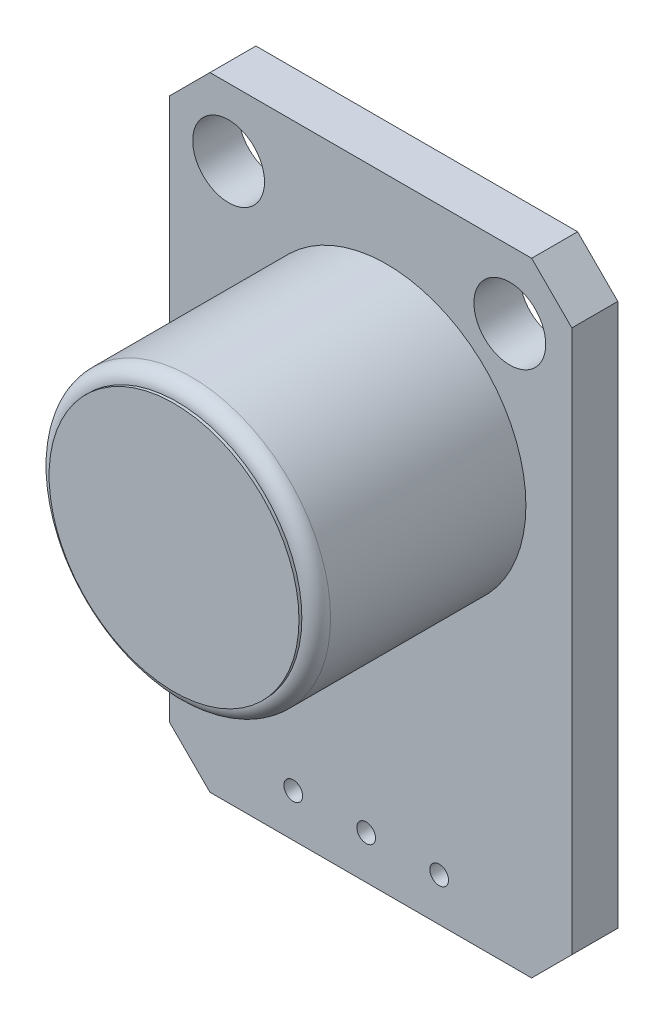
ISO-10303-21;
HEADER;
FILE_DESCRIPTION(('STEP AP214'),'2;1');
FILE_NAME('part.step','',(''),(''),'','','');
FILE_SCHEMA(('AUTOMOTIVE_DESIGN { 1 0 10303 214 1 1 1 1 }'));
ENDSEC;
DATA;
#1=APPLICATION_CONTEXT('core data for automotive mechanical design processes');
#2=APPLICATION_PROTOCOL_DEFINITION('international standard','automotive_design',2000,#1);
#3=PRODUCT_CONTEXT('',#1,'mechanical');
#4=PRODUCT('Part','Part','',(#3));
#5=PRODUCT_RELATED_PRODUCT_CATEGORY('part','',(#4));
#6=PRODUCT_DEFINITION_FORMATION('','',#4);
#7=PRODUCT_DEFINITION_CONTEXT('part definition',#1,'design');
#8=PRODUCT_DEFINITION('design','',#6,#7);
#9=PRODUCT_DEFINITION_SHAPE('','',#8);
#10=(LENGTH_UNIT() NAMED_UNIT(*) SI_UNIT(.MILLI.,.METRE.));
#11=(NAMED_UNIT(*) PLANE_ANGLE_UNIT() SI_UNIT($,.RADIAN.));
#12=(NAMED_UNIT(*) SI_UNIT($,.STERADIAN.) SOLID_ANGLE_UNIT());
#13=UNCERTAINTY_MEASURE_WITH_UNIT(LENGTH_MEASURE(1.E-05),#10,'distance_accuracy_value','');
#14=(GEOMETRIC_REPRESENTATION_CONTEXT(3) GLOBAL_UNCERTAINTY_ASSIGNED_CONTEXT((#13)) GLOBAL_UNIT_ASSIGNED_CONTEXT((#10,
#11,#12)) REPRESENTATION_CONTEXT('',''));
#15=CARTESIAN_POINT('',(0.,0.,0.));
#16=DIRECTION('',(0.,0.,1.));
#17=DIRECTION('',(1.,0.,0.));
#18=AXIS2_PLACEMENT_3D('',#15,#16,#17);
#19=CARTESIAN_POINT('',(-10.15,10.15,1.6));
#20=DIRECTION('',(-0.707106781186548,0.707106781186547,0.));
#21=DIRECTION('',(-0.707106781186547,-0.707106781186548,0.));
#22=AXIS2_PLACEMENT_3D('',#19,#20,#21);
#23=PLANE('',#22);
#24=DIRECTION('',(0.707106781186547,0.707106781186548,0.));
#25=VECTOR('',#24,1.);
#26=CARTESIAN_POINT('',(-10.15,10.15,0.));
#27=LINE('',#26,#25);
#28=CARTESIAN_POINT('',(0.,20.3,0.));
#29=VERTEX_POINT('',#28);
#30=CARTESIAN_POINT('',(1.4,21.7,0.));
#31=VERTEX_POINT('',#30);
#32=EDGE_CURVE('E145',#29,#31,#27,.T.);
#33=ORIENTED_EDGE('',*,*,#32,.F.);
#34=DIRECTION('',(0.,0.,-1.));
#35=VECTOR('',#34,1.);
#36=CARTESIAN_POINT('',(0.,20.3,1.6));
#37=LINE('',#36,#35);
#38=CARTESIAN_POINT('',(0.,20.3,1.6));
#39=VERTEX_POINT('',#38);
#40=EDGE_CURVE('E86',#39,#29,#37,.T.);
#41=ORIENTED_EDGE('',*,*,#40,.F.);
#42=DIRECTION('',(0.707106781186547,0.707106781186548,0.));
#43=VECTOR('',#42,1.);
#44=CARTESIAN_POINT('',(-10.15,10.15,1.6));
#45=LINE('',#44,#43);
#46=CARTESIAN_POINT('',(1.4,21.7,1.6));
#47=VERTEX_POINT('',#46);
#48=EDGE_CURVE('E254',#39,#47,#45,.T.);
#49=ORIENTED_EDGE('',*,*,#48,.T.);
#50=DIRECTION('',(0.,0.,-1.));
#51=VECTOR('',#50,1.);
#52=CARTESIAN_POINT('',(1.4,21.7,1.6));
#53=LINE('',#52,#51);
#54=EDGE_CURVE('E51',#47,#31,#53,.T.);
#55=ORIENTED_EDGE('',*,*,#54,.T.);
#56=EDGE_LOOP('',(#33,#41,#49,#55));
#57=FACE_BOUND('',#56,.T.);
#58=ADVANCED_FACE('F34',(#57),#23,.T.);
#59=CARTESIAN_POINT('',(0.,0.,1.6));
#60=DIRECTION('',(-1.,0.,0.));
#61=DIRECTION('',(0.,0.,1.));
#62=AXIS2_PLACEMENT_3D('',#59,#60,#61);
#63=PLANE('',#62);
#64=DIRECTION('',(0.,1.,0.));
#65=VECTOR('',#64,1.);
#66=CARTESIAN_POINT('',(0.,0.,0.));
#67=LINE('',#66,#65);
#68=CARTESIAN_POINT('',(0.,1.4,0.));
#69=VERTEX_POINT('',#68);
#70=EDGE_CURVE('E147',#69,#29,#67,.T.);
#71=ORIENTED_EDGE('',*,*,#70,.F.);
#72=DIRECTION('',(0.,0.,-1.));
#73=VECTOR('',#72,1.);
#74=CARTESIAN_POINT('',(0.,1.4,1.6));
#75=LINE('',#74,#73);
#76=CARTESIAN_POINT('',(0.,1.4,1.6));
#77=VERTEX_POINT('',#76);
#78=EDGE_CURVE('E175',#77,#69,#75,.T.);
#79=ORIENTED_EDGE('',*,*,#78,.F.);
#80=DIRECTION('',(0.,1.,0.));
#81=VECTOR('',#80,1.);
#82=CARTESIAN_POINT('',(0.,0.,1.6));
#83=LINE('',#82,#81);
#84=EDGE_CURVE('E251',#77,#39,#83,.T.);
#85=ORIENTED_EDGE('',*,*,#84,.T.);
#86=ORIENTED_EDGE('',*,*,#40,.T.);
#87=EDGE_LOOP('',(#71,#79,#85,#86));
#88=FACE_BOUND('',#87,.T.);
#89=ADVANCED_FACE('F197',(#88),#63,.T.);
#90=CARTESIAN_POINT('',(0.7,0.7,1.6));
#91=DIRECTION('',(0.707106781186548,0.707106781186548,0.));
#92=DIRECTION('',(-0.707106781186548,0.707106781186548,0.));
#93=AXIS2_PLACEMENT_3D('',#90,#91,#92);
#94=PLANE('',#93);
#95=DIRECTION('',(0.707106781186548,-0.707106781186548,0.));
#96=VECTOR('',#95,1.);
#97=CARTESIAN_POINT('',(0.7,0.7,0.));
#98=LINE('',#97,#96);
#99=CARTESIAN_POINT('',(1.4,0.,0.));
#100=VERTEX_POINT('',#99);
#101=EDGE_CURVE('E150',#69,#100,#98,.T.);
#102=ORIENTED_EDGE('',*,*,#101,.T.);
#103=DIRECTION('',(0.,0.,-1.));
#104=VECTOR('',#103,1.);
#105=CARTESIAN_POINT('',(1.4,0.,1.6));
#106=LINE('',#105,#104);
#107=CARTESIAN_POINT('',(1.4,0.,1.6));
#108=VERTEX_POINT('',#107);
#109=EDGE_CURVE('E172',#108,#100,#106,.T.);
#110=ORIENTED_EDGE('',*,*,#109,.F.);
#111=DIRECTION('',(0.707106781186548,-0.707106781186548,0.));
#112=VECTOR('',#111,1.);
#113=CARTESIAN_POINT('',(0.7,0.7,1.6));
#114=LINE('',#113,#112);
#115=EDGE_CURVE('E253',#77,#108,#114,.T.);
#116=ORIENTED_EDGE('',*,*,#115,.F.);
#117=ORIENTED_EDGE('',*,*,#78,.T.);
#118=EDGE_LOOP('',(#102,#110,#116,#117));
#119=FACE_BOUND('',#118,.T.);
#120=ADVANCED_FACE('F202',(#119),#94,.F.);
#121=CARTESIAN_POINT('',(0.,0.,1.6));
#122=DIRECTION('',(0.,1.,0.));
#123=DIRECTION('',(0.,0.,1.));
#124=AXIS2_PLACEMENT_3D('',#121,#122,#123);
#125=PLANE('',#124);
#126=DIRECTION('',(1.,0.,0.));
#127=VECTOR('',#126,1.);
#128=CARTESIAN_POINT('',(0.,0.,0.));
#129=LINE('',#128,#127);
#130=CARTESIAN_POINT('',(12.6,0.,0.));
#131=VERTEX_POINT('',#130);
#132=EDGE_CURVE('E153',#100,#131,#129,.T.);
#133=ORIENTED_EDGE('',*,*,#132,.T.);
#134=DIRECTION('',(0.,0.,-1.));
#135=VECTOR('',#134,1.);
#136=CARTESIAN_POINT('',(12.6,0.,1.6));
#137=LINE('',#136,#135);
#138=CARTESIAN_POINT('',(12.6,0.,1.6));
#139=VERTEX_POINT('',#138);
#140=EDGE_CURVE('E169',#139,#131,#137,.T.);
#141=ORIENTED_EDGE('',*,*,#140,.F.);
#142=DIRECTION('',(1.,0.,0.));
#143=VECTOR('',#142,1.);
#144=CARTESIAN_POINT('',(0.,0.,1.6));
#145=LINE('',#144,#143);
#146=EDGE_CURVE('E256',#108,#139,#145,.T.);
#147=ORIENTED_EDGE('',*,*,#146,.F.);
#148=ORIENTED_EDGE('',*,*,#109,.T.);
#149=EDGE_LOOP('',(#133,#141,#147,#148));
#150=FACE_BOUND('',#149,.T.);
#151=ADVANCED_FACE('F265',(#150),#125,.F.);
#152=CARTESIAN_POINT('',(6.3,-6.3,1.6));
#153=DIRECTION('',(-0.707106781186548,0.707106781186548,0.));
#154=DIRECTION('',(-0.707106781186548,-0.707106781186548,0.));
#155=AXIS2_PLACEMENT_3D('',#152,#153,#154);
#156=PLANE('',#155);
#157=DIRECTION('',(0.707106781186548,0.707106781186548,0.));
#158=VECTOR('',#157,1.);
#159=CARTESIAN_POINT('',(6.3,-6.3,0.));
#160=LINE('',#159,#158);
#161=CARTESIAN_POINT('',(14.,1.4,0.));
#162=VERTEX_POINT('',#161);
#163=EDGE_CURVE('E156',#131,#162,#160,.T.);
#164=ORIENTED_EDGE('',*,*,#163,.T.);
#165=DIRECTION('',(0.,0.,-1.));
#166=VECTOR('',#165,1.);
#167=CARTESIAN_POINT('',(14.,1.4,1.6));
#168=LINE('',#167,#166);
#169=CARTESIAN_POINT('',(14.,1.4,1.6));
#170=VERTEX_POINT('',#169);
#171=EDGE_CURVE('E121',#170,#162,#168,.T.);
#172=ORIENTED_EDGE('',*,*,#171,.F.);
#173=DIRECTION('',(0.707106781186548,0.707106781186548,0.));
#174=VECTOR('',#173,1.);
#175=CARTESIAN_POINT('',(6.3,-6.3,1.6));
#176=LINE('',#175,#174);
#177=EDGE_CURVE('E110',#139,#170,#176,.T.);
#178=ORIENTED_EDGE('',*,*,#177,.F.);
#179=ORIENTED_EDGE('',*,*,#140,.T.);
#180=EDGE_LOOP('',(#164,#172,#178,#179));
#181=FACE_BOUND('',#180,.T.);
#182=ADVANCED_FACE('F267',(#181),#156,.F.);
#183=CARTESIAN_POINT('',(14.,0.,1.6));
#184=DIRECTION('',(-1.,0.,0.));
#185=DIRECTION('',(0.,0.,1.));
#186=AXIS2_PLACEMENT_3D('',#183,#184,#185);
#187=PLANE('',#186);
#188=DIRECTION('',(0.,1.,0.));
#189=VECTOR('',#188,1.);
#190=CARTESIAN_POINT('',(14.,0.,0.));
#191=LINE('',#190,#189);
#192=CARTESIAN_POINT('',(14.,20.3,0.));
#193=VERTEX_POINT('',#192);
#194=EDGE_CURVE('E118',#162,#193,#191,.T.);
#195=ORIENTED_EDGE('',*,*,#194,.T.);
#196=DIRECTION('',(0.,0.,-1.));
#197=VECTOR('',#196,1.);
#198=CARTESIAN_POINT('',(14.,20.3,1.6));
#199=LINE('',#198,#197);
#200=CARTESIAN_POINT('',(14.,20.3,1.6));
#201=VERTEX_POINT('',#200);
#202=EDGE_CURVE('E116',#201,#193,#199,.T.);
#203=ORIENTED_EDGE('',*,*,#202,.F.);
#204=DIRECTION('',(0.,1.,0.));
#205=VECTOR('',#204,1.);
#206=CARTESIAN_POINT('',(14.,0.,1.6));
#207=LINE('',#206,#205);
#208=EDGE_CURVE('E103',#170,#201,#207,.T.);
#209=ORIENTED_EDGE('',*,*,#208,.F.);
#210=ORIENTED_EDGE('',*,*,#171,.T.);
#211=EDGE_LOOP('',(#195,#203,#209,#210));
#212=FACE_BOUND('',#211,.T.);
#213=ADVANCED_FACE('F117',(#212),#187,.F.);
#214=CARTESIAN_POINT('',(17.15,17.15,1.6));
#215=DIRECTION('',(0.707106781186548,0.707106781186547,0.));
#216=DIRECTION('',(-0.707106781186547,0.707106781186548,0.));
#217=AXIS2_PLACEMENT_3D('',#214,#215,#216);
#218=PLANE('',#217);
#219=DIRECTION('',(0.707106781186547,-0.707106781186548,0.));
#220=VECTOR('',#219,1.);
#221=CARTESIAN_POINT('',(17.15,17.15,0.));
#222=LINE('',#221,#220);
#223=CARTESIAN_POINT('',(12.6,21.7,0.));
#224=VERTEX_POINT('',#223);
#225=EDGE_CURVE('E160',#224,#193,#222,.T.);
#226=ORIENTED_EDGE('',*,*,#225,.F.);
#227=DIRECTION('',(0.,0.,-1.));
#228=VECTOR('',#227,1.);
#229=CARTESIAN_POINT('',(12.6,21.7,1.6));
#230=LINE('',#229,#228);
#231=CARTESIAN_POINT('',(12.6,21.7,1.6));
#232=VERTEX_POINT('',#231);
#233=EDGE_CURVE('E77',#232,#224,#230,.T.);
#234=ORIENTED_EDGE('',*,*,#233,.F.);
#235=DIRECTION('',(0.707106781186547,-0.707106781186548,0.));
#236=VECTOR('',#235,1.);
#237=CARTESIAN_POINT('',(17.15,17.15,1.6));
#238=LINE('',#237,#236);
#239=EDGE_CURVE('E108',#232,#201,#238,.T.);
#240=ORIENTED_EDGE('',*,*,#239,.T.);
#241=ORIENTED_EDGE('',*,*,#202,.T.);
#242=EDGE_LOOP('',(#226,#234,#240,#241));
#243=FACE_BOUND('',#242,.T.);
#244=ADVANCED_FACE('F123',(#243),#218,.T.);
#245=CARTESIAN_POINT('',(4.3,1.5,1.6));
#246=DIRECTION('',(0.,0.,-1.));
#247=DIRECTION('',(-1.,0.,0.));
#248=AXIS2_PLACEMENT_3D('',#245,#246,#247);
#249=CYLINDRICAL_SURFACE('',#248,0.325511788855648);
#250=CARTESIAN_POINT('',(4.3,1.5,1.6));
#251=DIRECTION('',(0.,0.,1.));
#252=DIRECTION('',(1.,0.,0.));
#253=AXIS2_PLACEMENT_3D('',#250,#251,#252);
#254=CIRCLE('',#253,0.325511788855648);
#255=CARTESIAN_POINT('',(4.62551178885565,1.5,1.6));
#256=VERTEX_POINT('',#255);
#257=EDGE_CURVE('E258',#256,#256,#254,.T.);
#258=ORIENTED_EDGE('',*,*,#257,.T.);
#259=EDGE_LOOP('',(#258));
#260=FACE_BOUND('',#259,.T.);
#261=CARTESIAN_POINT('',(4.3,1.5,0.));
#262=DIRECTION('',(0.,0.,1.));
#263=DIRECTION('',(1.,0.,0.));
#264=AXIS2_PLACEMENT_3D('',#261,#262,#263);
#265=CIRCLE('',#264,0.325511788855648);
#266=CARTESIAN_POINT('',(4.62551178885565,1.5,0.));
#267=VERTEX_POINT('',#266);
#268=EDGE_CURVE('E142',#267,#267,#265,.T.);
#269=ORIENTED_EDGE('',*,*,#268,.F.);
#270=EDGE_LOOP('',(#269));
#271=FACE_BOUND('',#270,.T.);
#272=ADVANCED_FACE('F207',(#260,#271),#249,.F.);
#273=CARTESIAN_POINT('',(6.84,1.5,1.6));
#274=DIRECTION('',(0.,0.,-1.));
#275=DIRECTION('',(-1.,0.,0.));
#276=AXIS2_PLACEMENT_3D('',#273,#274,#275);
#277=CYLINDRICAL_SURFACE('',#276,0.325511788855647);
#278=CARTESIAN_POINT('',(6.84,1.5,1.6));
#279=DIRECTION('',(0.,0.,1.));
#280=DIRECTION('',(1.,0.,0.));
#281=AXIS2_PLACEMENT_3D('',#278,#279,#280);
#282=CIRCLE('',#281,0.325511788855647);
#283=CARTESIAN_POINT('',(7.16551178885565,1.5,1.6));
#284=VERTEX_POINT('',#283);
#285=EDGE_CURVE('E302',#284,#284,#282,.T.);
#286=ORIENTED_EDGE('',*,*,#285,.T.);
#287=EDGE_LOOP('',(#286));
#288=FACE_BOUND('',#287,.T.);
#289=CARTESIAN_POINT('',(6.84,1.5,0.));
#290=DIRECTION('',(0.,0.,1.));
#291=DIRECTION('',(1.,0.,0.));
#292=AXIS2_PLACEMENT_3D('',#289,#290,#291);
#293=CIRCLE('',#292,0.325511788855647);
#294=CARTESIAN_POINT('',(7.16551178885565,1.5,0.));
#295=VERTEX_POINT('',#294);
#296=EDGE_CURVE('E139',#295,#295,#293,.T.);
#297=ORIENTED_EDGE('',*,*,#296,.F.);
#298=EDGE_LOOP('',(#297));
#299=FACE_BOUND('',#298,.T.);
#300=ADVANCED_FACE('F210',(#288,#299),#277,.F.);
#301=CARTESIAN_POINT('',(9.38,1.5,1.6));
#302=DIRECTION('',(0.,0.,-1.));
#303=DIRECTION('',(-1.,0.,0.));
#304=AXIS2_PLACEMENT_3D('',#301,#302,#303);
#305=CYLINDRICAL_SURFACE('',#304,0.325511788855649);
#306=CARTESIAN_POINT('',(9.38,1.5,1.6));
#307=DIRECTION('',(0.,0.,1.));
#308=DIRECTION('',(1.,0.,0.));
#309=AXIS2_PLACEMENT_3D('',#306,#307,#308);
#310=CIRCLE('',#309,0.325511788855649);
#311=CARTESIAN_POINT('',(9.70551178885565,1.5,1.6));
#312=VERTEX_POINT('',#311);
#313=EDGE_CURVE('E299',#312,#312,#310,.T.);
#314=ORIENTED_EDGE('',*,*,#313,.T.);
#315=EDGE_LOOP('',(#314));
#316=FACE_BOUND('',#315,.T.);
#317=CARTESIAN_POINT('',(9.38,1.5,0.));
#318=DIRECTION('',(0.,0.,1.));
#319=DIRECTION('',(1.,0.,0.));
#320=AXIS2_PLACEMENT_3D('',#317,#318,#319);
#321=CIRCLE('',#320,0.325511788855649);
#322=CARTESIAN_POINT('',(9.70551178885565,1.5,0.));
#323=VERTEX_POINT('',#322);
#324=EDGE_CURVE('E136',#323,#323,#321,.T.);
#325=ORIENTED_EDGE('',*,*,#324,.F.);
#326=EDGE_LOOP('',(#325));
#327=FACE_BOUND('',#326,.T.);
#328=ADVANCED_FACE('F214',(#316,#327),#305,.F.);
#329=CARTESIAN_POINT('',(11.84,19.35,1.6));
#330=DIRECTION('',(0.,0.,-1.));
#331=DIRECTION('',(-1.,0.,0.));
#332=AXIS2_PLACEMENT_3D('',#329,#330,#331);
#333=CYLINDRICAL_SURFACE('',#332,1.25);
#334=CARTESIAN_POINT('',(11.84,19.35,1.6));
#335=DIRECTION('',(0.,0.,1.));
#336=DIRECTION('',(1.,0.,0.));
#337=AXIS2_PLACEMENT_3D('',#334,#335,#336);
#338=CIRCLE('',#337,1.25);
#339=CARTESIAN_POINT('',(13.09,19.35,1.6));
#340=VERTEX_POINT('',#339);
#341=EDGE_CURVE('E296',#340,#340,#338,.T.);
#342=ORIENTED_EDGE('',*,*,#341,.T.);
#343=EDGE_LOOP('',(#342));
#344=FACE_BOUND('',#343,.T.);
#345=CARTESIAN_POINT('',(11.84,19.35,0.));
#346=DIRECTION('',(0.,0.,1.));
#347=DIRECTION('',(1.,0.,0.));
#348=AXIS2_PLACEMENT_3D('',#345,#346,#347);
#349=CIRCLE('',#348,1.25);
#350=CARTESIAN_POINT('',(13.09,19.35,0.));
#351=VERTEX_POINT('',#350);
#352=EDGE_CURVE('E132',#351,#351,#349,.T.);
#353=ORIENTED_EDGE('',*,*,#352,.F.);
#354=EDGE_LOOP('',(#353));
#355=FACE_BOUND('',#354,.T.);
#356=ADVANCED_FACE('F218',(#344,#355),#333,.F.);
#357=CARTESIAN_POINT('',(2.05,19.35,1.6));
#358=DIRECTION('',(0.,0.,-1.));
#359=DIRECTION('',(-1.,0.,0.));
#360=AXIS2_PLACEMENT_3D('',#357,#358,#359);
#361=CYLINDRICAL_SURFACE('',#360,1.25);
#362=CARTESIAN_POINT('',(2.05,19.35,1.6));
#363=DIRECTION('',(0.,0.,1.));
#364=DIRECTION('',(1.,0.,0.));
#365=AXIS2_PLACEMENT_3D('',#362,#363,#364);
#366=CIRCLE('',#365,1.25);
#367=CARTESIAN_POINT('',(3.3,19.35,1.6));
#368=VERTEX_POINT('',#367);
#369=EDGE_CURVE('E165',#368,#368,#366,.T.);
#370=ORIENTED_EDGE('',*,*,#369,.T.);
#371=EDGE_LOOP('',(#370));
#372=FACE_BOUND('',#371,.T.);
#373=CARTESIAN_POINT('',(2.05,19.35,0.));
#374=DIRECTION('',(0.,0.,1.));
#375=DIRECTION('',(1.,0.,0.));
#376=AXIS2_PLACEMENT_3D('',#373,#374,#375);
#377=CIRCLE('',#376,1.25);
#378=CARTESIAN_POINT('',(3.3,19.35,0.));
#379=VERTEX_POINT('',#378);
#380=EDGE_CURVE('E129',#379,#379,#377,.T.);
#381=ORIENTED_EDGE('',*,*,#380,.F.);
#382=EDGE_LOOP('',(#381));
#383=FACE_BOUND('',#382,.T.);
#384=ADVANCED_FACE('F221',(#372,#383),#361,.F.);
#385=CARTESIAN_POINT('',(0.,21.7,1.6));
#386=DIRECTION('',(0.,1.,0.));
#387=DIRECTION('',(0.,0.,1.));
#388=AXIS2_PLACEMENT_3D('',#385,#386,#387);
#389=PLANE('',#388);
#390=DIRECTION('',(1.,0.,0.));
#391=VECTOR('',#390,1.);
#392=CARTESIAN_POINT('',(0.,21.7,0.));
#393=LINE('',#392,#391);
#394=EDGE_CURVE('E162',#31,#224,#393,.T.);
#395=ORIENTED_EDGE('',*,*,#394,.F.);
#396=ORIENTED_EDGE('',*,*,#54,.F.);
#397=DIRECTION('',(1.,0.,0.));
#398=VECTOR('',#397,1.);
#399=CARTESIAN_POINT('',(0.,21.7,1.6));
#400=LINE('',#399,#398);
#401=EDGE_CURVE('E124',#47,#232,#400,.T.);
#402=ORIENTED_EDGE('',*,*,#401,.T.);
#403=ORIENTED_EDGE('',*,*,#233,.T.);
#404=EDGE_LOOP('',(#395,#396,#402,#403));
#405=FACE_BOUND('',#404,.T.);
#406=ADVANCED_FACE('F224',(#405),#389,.T.);
#407=CARTESIAN_POINT('',(0.,0.,1.6));
#408=DIRECTION('',(0.,0.,1.));
#409=DIRECTION('',(1.,0.,0.));
#410=AXIS2_PLACEMENT_3D('',#407,#408,#409);
#411=PLANE('',#410);
#412=CARTESIAN_POINT('',(7.55,14.15,1.6));
#413=DIRECTION('',(0.,0.,1.));
#414=DIRECTION('',(1.,0.,0.));
#415=AXIS2_PLACEMENT_3D('',#412,#413,#414);
#416=CIRCLE('',#415,4.85);
#417=CARTESIAN_POINT('',(12.4,14.15,1.6));
#418=VERTEX_POINT('',#417);
#419=EDGE_CURVE('E133',#418,#418,#416,.T.);
#420=ORIENTED_EDGE('',*,*,#419,.F.);
#421=EDGE_LOOP('',(#420));
#422=FACE_BOUND('',#421,.T.);
#423=ORIENTED_EDGE('',*,*,#369,.F.);
#424=EDGE_LOOP('',(#423));
#425=FACE_BOUND('',#424,.T.);
#426=ORIENTED_EDGE('',*,*,#341,.F.);
#427=EDGE_LOOP('',(#426));
#428=FACE_BOUND('',#427,.T.);
#429=ORIENTED_EDGE('',*,*,#313,.F.);
#430=EDGE_LOOP('',(#429));
#431=FACE_BOUND('',#430,.T.);
#432=ORIENTED_EDGE('',*,*,#285,.F.);
#433=EDGE_LOOP('',(#432));
#434=FACE_BOUND('',#433,.T.);
#435=ORIENTED_EDGE('',*,*,#257,.F.);
#436=EDGE_LOOP('',(#435));
#437=FACE_BOUND('',#436,.T.);
#438=ORIENTED_EDGE('',*,*,#48,.F.);
#439=ORIENTED_EDGE('',*,*,#84,.F.);
#440=ORIENTED_EDGE('',*,*,#115,.T.);
#441=ORIENTED_EDGE('',*,*,#146,.T.);
#442=ORIENTED_EDGE('',*,*,#177,.T.);
#443=ORIENTED_EDGE('',*,*,#208,.T.);
#444=ORIENTED_EDGE('',*,*,#239,.F.);
#445=ORIENTED_EDGE('',*,*,#401,.F.);
#446=EDGE_LOOP('',(#438,#439,#440,#441,#442,#443,#444,#445));
#447=FACE_BOUND('',#446,.T.);
#448=ADVANCED_FACE('F105',(#422,#425,#428,#431,#434,#437,#447),#411,.T.);
#449=CARTESIAN_POINT('',(0.,0.,0.));
#450=DIRECTION('',(0.,0.,1.));
#451=DIRECTION('',(1.,0.,0.));
#452=AXIS2_PLACEMENT_3D('',#449,#450,#451);
#453=PLANE('',#452);
#454=ORIENTED_EDGE('',*,*,#380,.T.);
#455=EDGE_LOOP('',(#454));
#456=FACE_BOUND('',#455,.T.);
#457=ORIENTED_EDGE('',*,*,#352,.T.);
#458=EDGE_LOOP('',(#457));
#459=FACE_BOUND('',#458,.T.);
#460=ORIENTED_EDGE('',*,*,#324,.T.);
#461=EDGE_LOOP('',(#460));
#462=FACE_BOUND('',#461,.T.);
#463=ORIENTED_EDGE('',*,*,#296,.T.);
#464=EDGE_LOOP('',(#463));
#465=FACE_BOUND('',#464,.T.);
#466=ORIENTED_EDGE('',*,*,#268,.T.);
#467=EDGE_LOOP('',(#466));
#468=FACE_BOUND('',#467,.T.);
#469=ORIENTED_EDGE('',*,*,#32,.T.);
#470=ORIENTED_EDGE('',*,*,#394,.T.);
#471=ORIENTED_EDGE('',*,*,#225,.T.);
#472=ORIENTED_EDGE('',*,*,#194,.F.);
#473=ORIENTED_EDGE('',*,*,#163,.F.);
#474=ORIENTED_EDGE('',*,*,#132,.F.);
#475=ORIENTED_EDGE('',*,*,#101,.F.);
#476=ORIENTED_EDGE('',*,*,#70,.T.);
#477=EDGE_LOOP('',(#469,#470,#471,#472,#473,#474,#475,#476));
#478=FACE_BOUND('',#477,.T.);
#479=ADVANCED_FACE('F192',(#456,#459,#462,#465,#468,#478),#453,.F.);
#480=CARTESIAN_POINT('',(7.55,14.15,8.9));
#481=DIRECTION('',(0.,0.,-1.));
#482=DIRECTION('',(-1.,0.,0.));
#483=AXIS2_PLACEMENT_3D('',#480,#481,#482);
#484=CYLINDRICAL_SURFACE('',#483,4.85);
#485=CARTESIAN_POINT('',(7.55,14.15,8.4));
#486=DIRECTION('',(0.,0.,1.));
#487=DIRECTION('',(1.,0.,0.));
#488=AXIS2_PLACEMENT_3D('',#485,#486,#487);
#489=CIRCLE('',#488,4.85);
#490=CARTESIAN_POINT('',(12.4,14.15,8.4));
#491=VERTEX_POINT('',#490);
#492=EDGE_CURVE('E11',#491,#491,#489,.F.);
#493=ORIENTED_EDGE('',*,*,#492,.T.);
#494=EDGE_LOOP('',(#493));
#495=FACE_BOUND('',#494,.T.);
#496=ORIENTED_EDGE('',*,*,#419,.T.);
#497=EDGE_LOOP('',(#496));
#498=FACE_BOUND('',#497,.T.);
#499=ADVANCED_FACE('F183',(#495,#498),#484,.T.);
#500=CARTESIAN_POINT('',(7.55,14.15,8.4));
#501=DIRECTION('',(0.,0.,1.));
#502=DIRECTION('',(1.,0.,0.));
#503=AXIS2_PLACEMENT_3D('',#500,#501,#502);
#504=TOROIDAL_SURFACE('',#503,4.35,0.5);
#505=ORIENTED_EDGE('',*,*,#492,.F.);
#506=EDGE_LOOP('',(#505));
#507=FACE_BOUND('',#506,.T.);
#508=CARTESIAN_POINT('',(7.55,14.15,8.9));
#509=DIRECTION('',(0.,0.,1.));
#510=DIRECTION('',(1.,0.,0.));
#511=AXIS2_PLACEMENT_3D('',#508,#509,#510);
#512=CIRCLE('',#511,4.35);
#513=CARTESIAN_POINT('',(11.9,14.15,8.9));
#514=VERTEX_POINT('',#513);
#515=EDGE_CURVE('E43',#514,#514,#512,.T.);
#516=ORIENTED_EDGE('',*,*,#515,.F.);
#517=EDGE_LOOP('',(#516));
#518=FACE_BOUND('',#517,.T.);
#519=ADVANCED_FACE('F36',(#507,#518),#504,.T.);
#520=CARTESIAN_POINT('',(7.55,14.15,9.));
#521=DIRECTION('',(0.,0.,-1.));
#522=DIRECTION('',(-1.,0.,0.));
#523=AXIS2_PLACEMENT_3D('',#520,#521,#522);
#524=CYLINDRICAL_SURFACE('',#523,4.35);
#525=CARTESIAN_POINT('',(7.55,14.15,9.));
#526=DIRECTION('',(0.,0.,1.));
#527=DIRECTION('',(1.,0.,0.));
#528=AXIS2_PLACEMENT_3D('',#525,#526,#527);
#529=CIRCLE('',#528,4.35);
#530=CARTESIAN_POINT('',(11.9,14.15,9.));
#531=VERTEX_POINT('',#530);
#532=EDGE_CURVE('E290',#531,#531,#529,.T.);
#533=ORIENTED_EDGE('',*,*,#532,.F.);
#534=EDGE_LOOP('',(#533));
#535=FACE_BOUND('',#534,.T.);
#536=ORIENTED_EDGE('',*,*,#515,.T.);
#537=EDGE_LOOP('',(#536));
#538=FACE_BOUND('',#537,.T.);
#539=ADVANCED_FACE('F180',(#535,#538),#524,.T.);
#540=CARTESIAN_POINT('',(7.55,14.15,9.));
#541=DIRECTION('',(0.,0.,1.));
#542=DIRECTION('',(1.,0.,0.));
#543=AXIS2_PLACEMENT_3D('',#540,#541,#542);
#544=PLANE('',#543);
#545=ORIENTED_EDGE('',*,*,#532,.T.);
#546=EDGE_LOOP('',(#545));
#547=FACE_BOUND('',#546,.T.);
#548=ADVANCED_FACE('F189',(#547),#544,.T.);
#549=CLOSED_SHELL('',(#58,#89,#120,#151,#182,#213,#244,#272,#300,#328,#356,#384,#406,#448,#479,
#499,#519,#539,#548));
#550=MANIFOLD_SOLID_BREP('B2',#549);
#551=ADVANCED_BREP_SHAPE_REPRESENTATION('',(#18,#550),#14);
#552=SHAPE_DEFINITION_REPRESENTATION(#9,#551);
ENDSEC;
END-ISO-10303-21;
